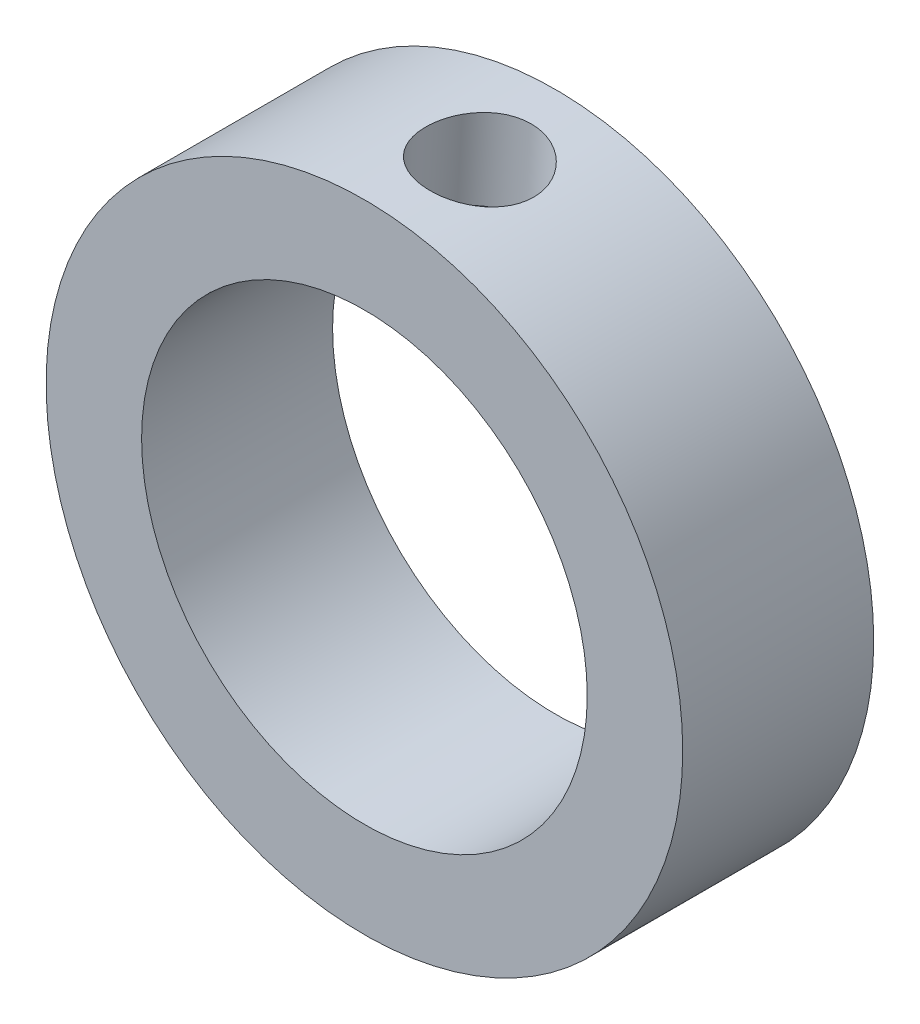
ISO-10303-21;
HEADER;
FILE_DESCRIPTION(('STEP AP214'),'2;1');
FILE_NAME('part.step','',(''),(''),'','','');
FILE_SCHEMA(('AUTOMOTIVE_DESIGN { 1 0 10303 214 1 1 1 1 }'));
ENDSEC;
DATA;
#1=APPLICATION_CONTEXT('core data for automotive mechanical design processes');
#2=APPLICATION_PROTOCOL_DEFINITION('international standard','automotive_design',2000,#1);
#3=PRODUCT_CONTEXT('',#1,'mechanical');
#4=PRODUCT('Part','Part','',(#3));
#5=PRODUCT_RELATED_PRODUCT_CATEGORY('part','',(#4));
#6=PRODUCT_DEFINITION_FORMATION('','',#4);
#7=PRODUCT_DEFINITION_CONTEXT('part definition',#1,'design');
#8=PRODUCT_DEFINITION('design','',#6,#7);
#9=PRODUCT_DEFINITION_SHAPE('','',#8);
#10=(LENGTH_UNIT() NAMED_UNIT(*) SI_UNIT(.MILLI.,.METRE.));
#11=(NAMED_UNIT(*) PLANE_ANGLE_UNIT() SI_UNIT($,.RADIAN.));
#12=(NAMED_UNIT(*) SI_UNIT($,.STERADIAN.) SOLID_ANGLE_UNIT());
#13=UNCERTAINTY_MEASURE_WITH_UNIT(LENGTH_MEASURE(1.E-05),#10,'distance_accuracy_value','');
#14=(GEOMETRIC_REPRESENTATION_CONTEXT(3) GLOBAL_UNCERTAINTY_ASSIGNED_CONTEXT((#13)) GLOBAL_UNIT_ASSIGNED_CONTEXT((#10,
#11,#12)) REPRESENTATION_CONTEXT('',''));
#15=CARTESIAN_POINT('',(0.,0.,0.));
#16=DIRECTION('',(0.,0.,1.));
#17=DIRECTION('',(1.,0.,0.));
#18=AXIS2_PLACEMENT_3D('',#15,#16,#17);
#19=CARTESIAN_POINT('',(0.,0.,15.));
#20=DIRECTION('',(0.,0.,1.));
#21=DIRECTION('',(1.,0.,0.));
#22=AXIS2_PLACEMENT_3D('',#19,#20,#21);
#23=PLANE('',#22);
#24=CARTESIAN_POINT('',(0.,0.,15.));
#25=DIRECTION('',(0.,0.,1.));
#26=DIRECTION('',(1.,0.,0.));
#27=AXIS2_PLACEMENT_3D('',#24,#25,#26);
#28=CIRCLE('',#27,25.);
#29=CARTESIAN_POINT('',(25.,0.,15.));
#30=VERTEX_POINT('',#29);
#31=EDGE_CURVE('E11',#30,#30,#28,.T.);
#32=ORIENTED_EDGE('',*,*,#31,.T.);
#33=EDGE_LOOP('',(#32));
#34=FACE_BOUND('',#33,.T.);
#35=CARTESIAN_POINT('',(0.,0.,15.));
#36=DIRECTION('',(0.,0.,1.));
#37=DIRECTION('',(1.,0.,0.));
#38=AXIS2_PLACEMENT_3D('',#35,#36,#37);
#39=CIRCLE('',#38,17.5);
#40=CARTESIAN_POINT('',(17.5,0.,15.));
#41=VERTEX_POINT('',#40);
#42=EDGE_CURVE('E96',#41,#41,#39,.T.);
#43=ORIENTED_EDGE('',*,*,#42,.F.);
#44=EDGE_LOOP('',(#43));
#45=FACE_BOUND('',#44,.T.);
#46=ADVANCED_FACE('F45',(#34,#45),#23,.T.);
#47=CARTESIAN_POINT('',(0.,0.,0.));
#48=DIRECTION('',(0.,0.,1.));
#49=DIRECTION('',(1.,0.,0.));
#50=AXIS2_PLACEMENT_3D('',#47,#48,#49);
#51=PLANE('',#50);
#52=CARTESIAN_POINT('',(0.,0.,0.));
#53=DIRECTION('',(0.,0.,1.));
#54=DIRECTION('',(1.,0.,0.));
#55=AXIS2_PLACEMENT_3D('',#52,#53,#54);
#56=CIRCLE('',#55,25.);
#57=CARTESIAN_POINT('',(25.,0.,0.));
#58=VERTEX_POINT('',#57);
#59=EDGE_CURVE('E60',#58,#58,#56,.T.);
#60=ORIENTED_EDGE('',*,*,#59,.F.);
#61=EDGE_LOOP('',(#60));
#62=FACE_BOUND('',#61,.T.);
#63=CARTESIAN_POINT('',(0.,0.,0.));
#64=DIRECTION('',(0.,0.,1.));
#65=DIRECTION('',(1.,0.,0.));
#66=AXIS2_PLACEMENT_3D('',#63,#64,#65);
#67=CIRCLE('',#66,17.5);
#68=CARTESIAN_POINT('',(17.5,0.,0.));
#69=VERTEX_POINT('',#68);
#70=EDGE_CURVE('E92',#69,#69,#67,.T.);
#71=ORIENTED_EDGE('',*,*,#70,.T.);
#72=EDGE_LOOP('',(#71));
#73=FACE_BOUND('',#72,.T.);
#74=ADVANCED_FACE('F120',(#62,#73),#51,.F.);
#75=CARTESIAN_POINT('',(0.,0.,15.));
#76=DIRECTION('',(0.,0.,-1.));
#77=DIRECTION('',(-1.,0.,0.));
#78=AXIS2_PLACEMENT_3D('',#75,#76,#77);
#79=CYLINDRICAL_SURFACE('',#78,25.);
#80=CARTESIAN_POINT('',(5.79910886241818,24.3181071714437,7.5));
#81=CARTESIAN_POINT('',(5.79909969648591,24.3181120930986,7.73686633759276));
#82=CARTESIAN_POINT('',(5.7794978567206,24.3228095772758,7.97386028363801));
#83=CARTESIAN_POINT('',(5.70162711065603,24.3411788471349,8.44119351969292));
#84=CARTESIAN_POINT('',(5.64332298139618,24.3548588076472,8.67152654814257));
#85=CARTESIAN_POINT('',(5.48981283600955,24.3899182145125,9.11870719435408));
#86=CARTESIAN_POINT('',(5.39463819707747,24.4112911130003,9.3355660971401));
#87=CARTESIAN_POINT('',(5.17008641565682,24.4598311769328,9.75002071999983));
#88=CARTESIAN_POINT('',(5.04071294095835,24.4869977209545,9.94761850270019));
#89=CARTESIAN_POINT('',(4.74992120219471,24.5450681520751,10.3199895082904));
#90=CARTESIAN_POINT('',(4.58821977132372,24.5760040474874,10.4945366403932));
#91=CARTESIAN_POINT('',(4.23785818705267,24.6388346487645,10.813886886464));
#92=CARTESIAN_POINT('',(4.04919641163436,24.6707294122267,10.958688209553));
#93=CARTESIAN_POINT('',(3.6487077429444,24.7331395902062,11.2152878059935));
#94=CARTESIAN_POINT('',(3.43674408043049,24.763645192817,11.3268752296216));
#95=CARTESIAN_POINT('',(2.99648503517794,24.8207632756389,11.5125237265016));
#96=CARTESIAN_POINT('',(2.76819075805018,24.8473760190325,11.5865873374417));
#97=CARTESIAN_POINT('',(2.30401238207459,24.8946862706227,11.694393115252));
#98=CARTESIAN_POINT('',(2.06822213240856,24.9154380886538,11.7285153710258));
#99=CARTESIAN_POINT('',(1.59378178658851,24.9502788649848,11.7566521124347));
#100=CARTESIAN_POINT('',(1.35513189350721,24.9643682935614,11.7506694294015));
#101=CARTESIAN_POINT('',(0.884349893754626,24.9854537948622,11.6990617875666));
#102=CARTESIAN_POINT('',(0.652175966987405,24.992521456771,11.6538459096472));
#103=CARTESIAN_POINT('',(0.198374760952398,25.0002436544723,11.5256999796285));
#104=CARTESIAN_POINT('',(-0.0232521867825806,25.0008979888012,11.4427687428518));
#105=CARTESIAN_POINT('',(-0.450814296880639,24.9968545853101,11.2411422286282));
#106=CARTESIAN_POINT('',(-0.656670032056307,24.9921314432793,11.1222791578506));
#107=CARTESIAN_POINT('',(-1.04587401476352,24.9788735875945,10.8522860966107));
#108=CARTESIAN_POINT('',(-1.22922036688988,24.9703385532401,10.7011533918113));
#109=CARTESIAN_POINT('',(-1.57052797064025,24.9512140600773,10.3686444370736));
#110=CARTESIAN_POINT('',(-1.72813966417335,24.9406000339079,10.18691058579));
#111=CARTESIAN_POINT('',(-2.01063609804101,24.9194195794054,9.79956089124775));
#112=CARTESIAN_POINT('',(-2.13552051235963,24.9088531515474,9.59394481011347));
#113=CARTESIAN_POINT('',(-2.3489919897412,24.8896322448388,9.16425211233593));
#114=CARTESIAN_POINT('',(-2.43753530300407,24.8809800762385,8.94015363268381));
#115=CARTESIAN_POINT('',(-2.57533799062253,24.8670962830981,8.48008931539898));
#116=CARTESIAN_POINT('',(-2.6246009728247,24.8618643444223,8.24412456978402));
#117=CARTESIAN_POINT('',(-2.68189804820432,24.8557489126781,7.77016489051098));
#118=CARTESIAN_POINT('',(-2.69043662635387,24.8548122167292,7.53223157506248));
#119=CARTESIAN_POINT('',(-2.66738018214936,24.8572969640039,7.05834886115499));
#120=CARTESIAN_POINT('',(-2.63578677539323,24.8607182317886,6.82239938321734));
#121=CARTESIAN_POINT('',(-2.53382299295223,24.8713150612955,6.36077914969961));
#122=CARTESIAN_POINT('',(-2.46371043197029,24.8784656461596,6.13505073923916));
#123=CARTESIAN_POINT('',(-2.28703056195994,24.8953272580706,5.69844783154683));
#124=CARTESIAN_POINT('',(-2.1804609932447,24.9050384438207,5.48757425602808));
#125=CARTESIAN_POINT('',(-1.93279383429476,24.9254856857074,5.08444459056095));
#126=CARTESIAN_POINT('',(-1.79137524627668,24.9362306688422,4.89238620927819));
#127=CARTESIAN_POINT('',(-1.47857143431657,24.9567292426003,4.53438523591321));
#128=CARTESIAN_POINT('',(-1.30718401405477,24.9664827604794,4.36844455960874));
#129=CARTESIAN_POINT('',(-0.937186140241612,24.9831198921576,4.06555680786976));
#130=CARTESIAN_POINT('',(-0.738300607043419,24.9899712342488,3.92894368972298));
#131=CARTESIAN_POINT('',(-0.320365998977118,24.9988197597215,3.69093088033262));
#132=CARTESIAN_POINT('',(-0.101317596781151,25.0008171049809,3.58953001487875));
#133=CARTESIAN_POINT('',(0.349656764839151,24.9985661822956,3.42533680067741));
#134=CARTESIAN_POINT('',(0.581519778120275,24.9943462144824,3.36237134271728));
#135=CARTESIAN_POINT('',(1.05229895954594,24.97895301964,3.2762795846569));
#136=CARTESIAN_POINT('',(1.29121452107695,24.9677803889823,3.25314986824694));
#137=CARTESIAN_POINT('',(1.76608160350009,24.9386615714811,3.24748762558934));
#138=CARTESIAN_POINT('',(2.00203256470255,24.9208024506323,3.26444755638516));
#139=CARTESIAN_POINT('',(2.46726860775256,24.8790504309979,3.33738328042555));
#140=CARTESIAN_POINT('',(2.69655373065208,24.8551575693802,3.39335883333697));
#141=CARTESIAN_POINT('',(3.14179413261696,24.8028095073222,3.54253909795843));
#142=CARTESIAN_POINT('',(3.3577651024025,24.7743598251602,3.63569898074952));
#143=CARTESIAN_POINT('',(3.77086714057759,24.7148572061212,3.85654631565689));
#144=CARTESIAN_POINT('',(3.96799725720939,24.6838041378811,3.98423551079712));
#145=CARTESIAN_POINT('',(4.34044830433555,24.6210611254895,4.27230823995791));
#146=CARTESIAN_POINT('',(4.51548182712825,24.5893679997961,4.43306271290528));
#147=CARTESIAN_POINT('',(4.83633128115942,24.5282825102068,4.78192540759987));
#148=CARTESIAN_POINT('',(4.98214035847984,24.4988906870107,4.97004002822788));
#149=CARTESIAN_POINT('',(5.24150280217844,24.4447209725217,5.36993710244371));
#150=CARTESIAN_POINT('',(5.35480969349483,24.4199788042288,5.58188427442632));
#151=CARTESIAN_POINT('',(5.54439286129435,24.3776377717621,6.02224309250364));
#152=CARTESIAN_POINT('',(5.6207058234795,24.3600318336677,6.25063816844438));
#153=CARTESIAN_POINT('',(5.71779427860102,24.3373885378431,6.64990960690035));
#154=CARTESIAN_POINT('',(5.74823916248623,24.3301908343399,6.81837975545373));
#155=CARTESIAN_POINT('',(5.78889956865684,24.320548419705,7.15787777574936));
#156=CARTESIAN_POINT('',(5.7991154831973,24.318103616411,7.32890559783158));
#157=CARTESIAN_POINT('',(5.79910886241818,24.3181071714437,7.5));
#158=B_SPLINE_CURVE_WITH_KNOTS('',3,(#80,#81,#82,#83,#84,#85,#86,#87,#88,#89,#90,#91,#92,#93,
#94,#95,#96,#97,#98,#99,#100,#101,#102,#103,#104,#105,#106,#107,#108,#109,#110,#111,#112,#113,
#114,#115,#116,#117,#118,#119,#120,#121,#122,#123,#124,#125,#126,#127,#128,#129,#130,#131,#132,
#133,#134,#135,#136,#137,#138,#139,#140,#141,#142,#143,#144,#145,#146,#147,#148,#149,#150,#151,
#152,#153,#154,#155,#156,#157),.UNSPECIFIED.,.T.,.F.,(4,2,2,2,2,2,2,2,2,2,2,2,2,2,2,2,2,2,2,2,2,
2,2,2,2,2,2,2,2,2,2,2,2,2,2,2,2,2,4),(0.,0.709973283425506,1.42059360118636,2.13061049729956,
2.84055127570153,3.55700687584352,4.27350559834585,4.99446029694993,5.71536623178395,
6.42935464344853,7.14329264943283,7.84987474670908,8.55647903997359,9.26643536569997,
9.97645143243689,10.6954278445864,11.4144114186161,12.1342580311803,12.8540385191643,
13.5648789502415,14.2756907658408,14.9818019652787,15.6879569389991,16.4008768753804,
17.1138490812958,17.8345535743724,18.5552340320677,19.2726441956478,19.9899928311309,
20.6983084234592,21.4066196526579,22.1140795183679,22.8215751029981,23.5374888916993,
24.2535703854682,24.9749466851158,25.6956061479643,26.2084473191898,26.7212785459388),.UNSPECIFIED.);
#159=CARTESIAN_POINT('',(5.79910886241818,24.3181071714437,7.5));
#160=VERTEX_POINT('',#159);
#161=EDGE_CURVE('E50',#160,#160,#158,.T.);
#162=ORIENTED_EDGE('',*,*,#161,.T.);
#163=EDGE_LOOP('',(#162));
#164=FACE_BOUND('',#163,.T.);
#165=ORIENTED_EDGE('',*,*,#31,.F.);
#166=EDGE_LOOP('',(#165));
#167=FACE_BOUND('',#166,.T.);
#168=ORIENTED_EDGE('',*,*,#59,.T.);
#169=EDGE_LOOP('',(#168));
#170=FACE_BOUND('',#169,.T.);
#171=ADVANCED_FACE('F47',(#164,#167,#170),#79,.T.);
#172=CARTESIAN_POINT('',(0.,0.,15.));
#173=DIRECTION('',(0.,0.,-1.));
#174=DIRECTION('',(-1.,0.,0.));
#175=AXIS2_PLACEMENT_3D('',#172,#173,#174);
#176=CYLINDRICAL_SURFACE('',#175,17.5);
#177=CARTESIAN_POINT('',(1.10643342332909,17.4649879782306,2.475));
#178=CARTESIAN_POINT('',(1.38208398755351,17.447521888678,2.47500473045724));
#179=CARTESIAN_POINT('',(1.65736595083719,17.4234700782476,2.4978485053317));
#180=CARTESIAN_POINT('',(2.19914615263854,17.3634141524577,2.58842529223593));
#181=CARTESIAN_POINT('',(2.46564109821134,17.3274056110261,2.6561749365206));
#182=CARTESIAN_POINT('',(2.98206138210477,17.2460312686552,2.83413993008231));
#183=CARTESIAN_POINT('',(3.23200938176412,17.2006786302187,2.94429573173299));
#184=CARTESIAN_POINT('',(3.70943516734273,17.1040782934814,3.20371114284587));
#185=CARTESIAN_POINT('',(3.93691053464218,17.0528299619379,3.35297495501258));
#186=CARTESIAN_POINT('',(4.36914431071692,16.9473094949422,3.69054537839725));
#187=CARTESIAN_POINT('',(4.57323057620002,16.8929943766089,3.8796991596088));
#188=CARTESIAN_POINT('',(4.94733524335572,16.7872494839636,4.2898725183012));
#189=CARTESIAN_POINT('',(5.11734847770046,16.7358201481437,4.5108969203783));
#190=CARTESIAN_POINT('',(5.42204716003342,16.6396372000926,4.9840621095029));
#191=CARTESIAN_POINT('',(5.55594428680228,16.5950405281802,5.23674405713109));
#192=CARTESIAN_POINT('',(5.77975128493159,16.5184311411362,5.76266782960956));
#193=CARTESIAN_POINT('',(5.86967072578477,16.4864156886443,6.03590516668709));
#194=CARTESIAN_POINT('',(6.00079779486993,16.4391363630408,6.58772081295747));
#195=CARTESIAN_POINT('',(6.04320553878463,16.4234605119185,6.86597803204415));
#196=CARTESIAN_POINT('',(6.08192326324883,16.4091642920414,7.42608831790748));
#197=CARTESIAN_POINT('',(6.0782433714699,16.4105401761989,7.70794058108084));
#198=CARTESIAN_POINT('',(6.02582868586017,16.4298533165987,8.2574517086642));
#199=CARTESIAN_POINT('',(5.97857421302958,16.4472464085167,8.52527302478962));
#200=CARTESIAN_POINT('',(5.84265854424106,16.496014755021,9.04884634064742));
#201=CARTESIAN_POINT('',(5.75399357138936,16.5273912849714,9.30459723713969));
#202=CARTESIAN_POINT('',(5.53650270270362,16.601518962166,9.80056384314585));
#203=CARTESIAN_POINT('',(5.40717870350808,16.6444101649267,10.0405396327435));
#204=CARTESIAN_POINT('',(5.11220421946523,16.7373600533947,10.4954885783405));
#205=CARTESIAN_POINT('',(4.9465455762667,16.7874203479269,10.7104561025257));
#206=CARTESIAN_POINT('',(4.57592882667281,16.8922846234957,11.1178868045046));
#207=CARTESIAN_POINT('',(4.36971432251804,16.9471966556259,11.3091811590042));
#208=CARTESIAN_POINT('',(3.92747738305359,17.0551063516822,11.6542190634547));
#209=CARTESIAN_POINT('',(3.69145337301038,17.1081039142832,11.8079606283613));
#210=CARTESIAN_POINT('',(3.19411942893605,17.207911126451,12.0741592647034));
#211=CARTESIAN_POINT('',(2.93267311400893,17.2546838072044,12.1863761726894));
#212=CARTESIAN_POINT('',(2.39289597368074,17.3377765558439,12.3645022862546));
#213=CARTESIAN_POINT('',(2.11456946798323,17.3740992843602,12.4304232852632));
#214=CARTESIAN_POINT('',(1.55873615316706,17.4326085942657,12.5121847528769));
#215=CARTESIAN_POINT('',(1.28150736658594,17.4552234312738,12.5296112271974));
#216=CARTESIAN_POINT('',(0.727245519162295,17.4870849047601,12.5183082472452));
#217=CARTESIAN_POINT('',(0.450212438656616,17.4963331625379,12.4895843916705));
#218=CARTESIAN_POINT('',(-0.0898870487293075,17.5018124074115,12.3880865821434));
#219=CARTESIAN_POINT('',(-0.353123049576405,17.4983049270663,12.3162225921124));
#220=CARTESIAN_POINT('',(-0.864420434910357,17.4805113463213,12.1315640318534));
#221=CARTESIAN_POINT('',(-1.11248005313065,17.4662239939023,12.018764708015));
#222=CARTESIAN_POINT('',(-1.59224550977414,17.4291122117009,11.7526650032253));
#223=CARTESIAN_POINT('',(-1.82347697071579,17.4061084701864,11.5985353358027));
#224=CARTESIAN_POINT('',(-2.25762515689285,17.3551430243893,11.2551712285357));
#225=CARTESIAN_POINT('',(-2.46053535726597,17.3271801809501,11.06592872245));
#226=CARTESIAN_POINT('',(-2.83902360574824,17.2692750950562,10.6502744196334));
#227=CARTESIAN_POINT('',(-3.01347624068458,17.2392979759159,10.4228406178739));
#228=CARTESIAN_POINT('',(-3.32154102134446,17.1826072053614,9.941419014225));
#229=CARTESIAN_POINT('',(-3.45515455876146,17.1558934427588,9.68743211759396));
#230=CARTESIAN_POINT('',(-3.67658063799339,17.1098088345068,9.16114647870949));
#231=CARTESIAN_POINT('',(-3.76463346949372,17.0903996153958,8.88895253806857));
#232=CARTESIAN_POINT('',(-3.89272601735514,17.0616844445449,8.33300062253183));
#233=CARTESIAN_POINT('',(-3.9327804648784,17.0523753930502,8.04924622331026));
#234=CARTESIAN_POINT('',(-3.96272607320882,17.0454394729648,7.48984907859459));
#235=CARTESIAN_POINT('',(-3.95447195371632,17.0473806438935,7.21430965103988));
#236=CARTESIAN_POINT('',(-3.89242599860293,17.0616532405099,6.66870341619388));
#237=CARTESIAN_POINT('',(-3.83863571114796,17.0739843129555,6.39863642316711));
#238=CARTESIAN_POINT('',(-3.68827956516661,17.1070857210033,5.87434796434683));
#239=CARTESIAN_POINT('',(-3.59216467549392,17.1277668980881,5.61999084912819));
#240=CARTESIAN_POINT('',(-3.36037406463178,17.1747432885489,5.13056000613294));
#241=CARTESIAN_POINT('',(-3.224691283774,17.2010395035306,4.89548972909549));
#242=CARTESIAN_POINT('',(-2.91243750416493,17.2566979892332,4.44274492094372));
#243=CARTESIAN_POINT('',(-2.73464307691971,17.2861337049355,4.2259231632541));
#244=CARTESIAN_POINT('',(-2.34571224340689,17.3431889824401,3.82422872879128));
#245=CARTESIAN_POINT('',(-2.13456742835494,17.3708080837169,3.63936413420934));
#246=CARTESIAN_POINT('',(-1.67853083243125,17.4208620749548,3.30206597734794));
#247=CARTESIAN_POINT('',(-1.43290442513267,17.4431435225853,3.15060047812013));
#248=CARTESIAN_POINT('',(-0.919147323861702,17.4777363748749,2.89102036314006));
#249=CARTESIAN_POINT('',(-0.651028851259492,17.4900531557376,2.78288238695126));
#250=CARTESIAN_POINT('',(-0.135845533694885,17.501118253029,2.6245053119319));
#251=CARTESIAN_POINT('',(0.109452513568586,17.5014164496234,2.56858376957017));
#252=CARTESIAN_POINT('',(0.605413361398545,17.4912823144054,2.49383150290771));
#253=CARTESIAN_POINT('',(0.856075423177409,17.480851451114,2.47499570359009));
#254=CARTESIAN_POINT('',(1.10643342332909,17.4649879782306,2.475));
#255=B_SPLINE_CURVE_WITH_KNOTS('',3,(#177,#178,#179,#180,#181,#182,#183,#184,#185,#186,#187,
#188,#189,#190,#191,#192,#193,#194,#195,#196,#197,#198,#199,#200,#201,#202,#203,#204,#205,#206,
#207,#208,#209,#210,#211,#212,#213,#214,#215,#216,#217,#218,#219,#220,#221,#222,#223,#224,#225,
#226,#227,#228,#229,#230,#231,#232,#233,#234,#235,#236,#237,#238,#239,#240,#241,#242,#243,#244,
#245,#246,#247,#248,#249,#250,#251,#252,#253,#254),.UNSPECIFIED.,.T.,.F.,(4,2,2,2,2,2,2,2,2,2,2,
2,2,2,2,2,2,2,2,2,2,2,2,2,2,2,2,2,2,2,2,2,2,2,2,2,2,2,4),(0.,0.827689227328548,1.65568518597512,
2.48252267140841,3.30944904860265,4.15612103621402,5.00292132842602,5.86693384975856,
6.73075827924191,7.57223321219943,8.41352323586247,9.22724566899932,10.0410423331534,
10.8652248937944,11.689592700966,12.5453553244137,13.4011631737771,14.2618460808811,
15.12230965784,15.9542812773168,16.7861519743033,17.6010637634799,18.4160702144813,
19.2488431230376,20.0818075764226,20.9423106268634,21.8027843502598,22.6586724042448,
23.5142977106854,24.3372938718928,25.1602620535072,25.9746660234681,26.789215387662,
27.6312045228006,28.4734062923582,29.3375030592851,30.2011333114614,30.9529800674148,
31.7047239293732),.UNSPECIFIED.);
#256=CARTESIAN_POINT('',(1.10643342332909,17.4649879782306,12.525));
#257=VERTEX_POINT('',#256);
#258=CARTESIAN_POINT('',(1.10643342332909,17.4649879782306,2.475));
#259=VERTEX_POINT('',#258);
#260=EDGE_CURVE('E83',#257,#259,#255,.T.);
#261=ORIENTED_EDGE('',*,*,#260,.F.);
#262=EDGE_CURVE('E81',#259,#257,#255,.T.);
#263=ORIENTED_EDGE('',*,*,#262,.F.);
#264=EDGE_LOOP('',(#261,#263));
#265=FACE_BOUND('',#264,.T.);
#266=ORIENTED_EDGE('',*,*,#42,.T.);
#267=EDGE_LOOP('',(#266));
#268=FACE_BOUND('',#267,.T.);
#269=ORIENTED_EDGE('',*,*,#70,.F.);
#270=EDGE_LOOP('',(#269));
#271=FACE_BOUND('',#270,.T.);
#272=ADVANCED_FACE('F89',(#265,#268,#271),#176,.F.);
#273=CARTESIAN_POINT('',(1.10643342332909,17.4649879782306,7.5));
#274=DIRECTION('',(-0.0632247670473768,-0.99799931304175,0.));
#275=DIRECTION('',(0.99799931304175,-0.0632247670473768,0.));
#276=AXIS2_PLACEMENT_3D('',#273,#274,#275);
#277=CYLINDRICAL_SURFACE('',#276,5.025);
#278=ORIENTED_EDGE('',*,*,#262,.T.);
#279=CARTESIAN_POINT('',(1.10643342332909,17.4649879782306,7.5));
#280=DIRECTION('',(-0.0632247670473768,-0.99799931304175,0.));
#281=DIRECTION('',(0.99799931304175,-0.0632247670473768,0.));
#282=AXIS2_PLACEMENT_3D('',#279,#280,#281);
#283=CIRCLE('',#282,5.025);
#284=EDGE_CURVE('E67',#259,#257,#283,.T.);
#285=ORIENTED_EDGE('',*,*,#284,.F.);
#286=EDGE_LOOP('',(#278,#285));
#287=FACE_BOUND('',#286,.T.);
#288=ADVANCED_FACE('F79',(#287),#277,.F.);
#289=ORIENTED_EDGE('',*,*,#260,.T.);
#290=CARTESIAN_POINT('',(1.10643342332909,17.4649879782306,7.5));
#291=DIRECTION('',(-0.0632247670473768,-0.99799931304175,0.));
#292=DIRECTION('',(0.99799931304175,-0.0632247670473768,0.));
#293=AXIS2_PLACEMENT_3D('',#290,#291,#292);
#294=CIRCLE('',#293,5.025);
#295=EDGE_CURVE('E70',#257,#259,#294,.T.);
#296=ORIENTED_EDGE('',*,*,#295,.F.);
#297=EDGE_LOOP('',(#289,#296));
#298=FACE_BOUND('',#297,.T.);
#299=ADVANCED_FACE('F85',(#298),#277,.F.);
#300=CARTESIAN_POINT('',(1.10643342332909,17.4649879782306,7.5));
#301=DIRECTION('',(-0.0632247670473768,-0.99799931304175,0.));
#302=DIRECTION('',(0.99799931304175,-0.0632247670473768,0.));
#303=AXIS2_PLACEMENT_3D('',#300,#301,#302);
#304=CYLINDRICAL_SURFACE('',#303,4.24999999999999);
#305=CARTESIAN_POINT('',(1.15543261779081,18.238437445838,7.5));
#306=DIRECTION('',(-0.0632247670473768,-0.99799931304175,0.));
#307=DIRECTION('',(0.99799931304175,-0.0632247670473768,0.));
#308=AXIS2_PLACEMENT_3D('',#305,#306,#307);
#309=CIRCLE('',#308,4.25);
#310=CARTESIAN_POINT('',(5.39692969821824,17.9697321858866,7.5));
#311=VERTEX_POINT('',#310);
#312=EDGE_CURVE('E76',#311,#311,#309,.T.);
#313=ORIENTED_EDGE('',*,*,#312,.T.);
#314=EDGE_LOOP('',(#313));
#315=FACE_BOUND('',#314,.T.);
#316=ORIENTED_EDGE('',*,*,#161,.F.);
#317=EDGE_LOOP('',(#316));
#318=FACE_BOUND('',#317,.T.);
#319=ADVANCED_FACE('F109',(#315,#318),#304,.F.);
#320=CARTESIAN_POINT('',(1.10643342332909,17.4649879782306,7.5));
#321=DIRECTION('',(-0.0632247670473768,-0.99799931304175,0.));
#322=DIRECTION('',(0.99799931304175,-0.0632247670473768,0.));
#323=AXIS2_PLACEMENT_3D('',#320,#321,#322);
#324=CONICAL_SURFACE('',#323,5.025,0.78539816339745);
#325=ORIENTED_EDGE('',*,*,#312,.F.);
#326=EDGE_LOOP('',(#325));
#327=FACE_BOUND('',#326,.T.);
#328=ORIENTED_EDGE('',*,*,#295,.T.);
#329=ORIENTED_EDGE('',*,*,#284,.T.);
#330=EDGE_LOOP('',(#328,#329));
#331=FACE_BOUND('',#330,.T.);
#332=ADVANCED_FACE('F71',(#327,#331),#324,.F.);
#333=CLOSED_SHELL('',(#46,#74,#171,#272,#288,#299,#319,#332));
#334=MANIFOLD_SOLID_BREP('B2',#333);
#335=ADVANCED_BREP_SHAPE_REPRESENTATION('',(#18,#334),#14);
#336=SHAPE_DEFINITION_REPRESENTATION(#9,#335);
ENDSEC;
END-ISO-10303-21;
